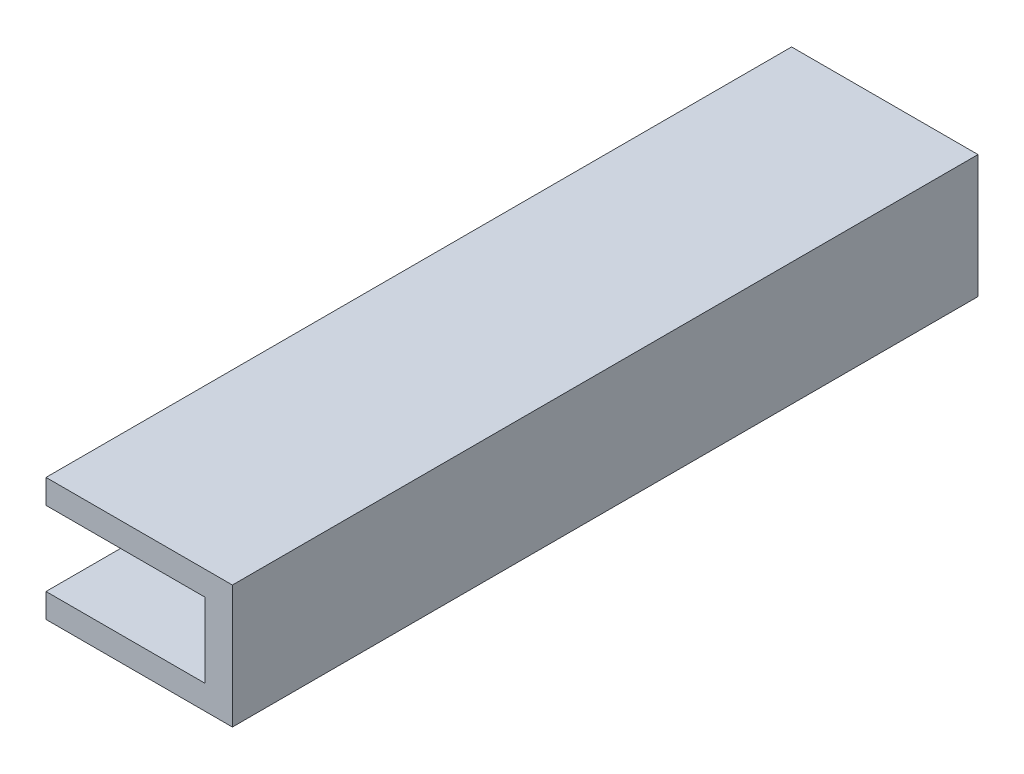
ISO-10303-21;
HEADER;
FILE_DESCRIPTION(('STEP AP214'),'2;1');
FILE_NAME('part.step','',(''),(''),'','','');
FILE_SCHEMA(('AUTOMOTIVE_DESIGN { 1 0 10303 214 1 1 1 1 }'));
ENDSEC;
DATA;
#1=APPLICATION_CONTEXT('core data for automotive mechanical design processes');
#2=APPLICATION_PROTOCOL_DEFINITION('international standard','automotive_design',2000,#1);
#3=PRODUCT_CONTEXT('',#1,'mechanical');
#4=PRODUCT('Part','Part','',(#3));
#5=PRODUCT_RELATED_PRODUCT_CATEGORY('part','',(#4));
#6=PRODUCT_DEFINITION_FORMATION('','',#4);
#7=PRODUCT_DEFINITION_CONTEXT('part definition',#1,'design');
#8=PRODUCT_DEFINITION('design','',#6,#7);
#9=PRODUCT_DEFINITION_SHAPE('','',#8);
#10=(LENGTH_UNIT() NAMED_UNIT(*) SI_UNIT(.MILLI.,.METRE.));
#11=(NAMED_UNIT(*) PLANE_ANGLE_UNIT() SI_UNIT($,.RADIAN.));
#12=(NAMED_UNIT(*) SI_UNIT($,.STERADIAN.) SOLID_ANGLE_UNIT());
#13=UNCERTAINTY_MEASURE_WITH_UNIT(LENGTH_MEASURE(1.E-05),#10,'distance_accuracy_value','');
#14=(GEOMETRIC_REPRESENTATION_CONTEXT(3) GLOBAL_UNCERTAINTY_ASSIGNED_CONTEXT((#13)) GLOBAL_UNIT_ASSIGNED_CONTEXT((#10,
#11,#12)) REPRESENTATION_CONTEXT('',''));
#15=CARTESIAN_POINT('',(0.,0.,0.));
#16=DIRECTION('',(0.,0.,1.));
#17=DIRECTION('',(1.,0.,0.));
#18=AXIS2_PLACEMENT_3D('',#15,#16,#17);
#19=CARTESIAN_POINT('',(-50.,33.,200.));
#20=DIRECTION('',(1.,0.,0.));
#21=DIRECTION('',(0.,0.,-1.));
#22=AXIS2_PLACEMENT_3D('',#19,#20,#21);
#23=PLANE('',#22);
#24=DIRECTION('',(0.,-1.,0.));
#25=VECTOR('',#24,1.);
#26=CARTESIAN_POINT('',(-50.,33.,0.));
#27=LINE('',#26,#25);
#28=CARTESIAN_POINT('',(-50.,33.,0.));
#29=VERTEX_POINT('',#28);
#30=CARTESIAN_POINT('',(-50.,26.5,0.));
#31=VERTEX_POINT('',#30);
#32=EDGE_CURVE('E133',#29,#31,#27,.T.);
#33=ORIENTED_EDGE('',*,*,#32,.T.);
#34=DIRECTION('',(0.,0.,-1.));
#35=VECTOR('',#34,1.);
#36=CARTESIAN_POINT('',(-50.,26.5,200.));
#37=LINE('',#36,#35);
#38=CARTESIAN_POINT('',(-50.,26.5,200.));
#39=VERTEX_POINT('',#38);
#40=EDGE_CURVE('E11',#39,#31,#37,.T.);
#41=ORIENTED_EDGE('',*,*,#40,.F.);
#42=DIRECTION('',(0.,-1.,0.));
#43=VECTOR('',#42,1.);
#44=CARTESIAN_POINT('',(-50.,33.,200.));
#45=LINE('',#44,#43);
#46=CARTESIAN_POINT('',(-50.,33.,200.));
#47=VERTEX_POINT('',#46);
#48=EDGE_CURVE('E147',#47,#39,#45,.T.);
#49=ORIENTED_EDGE('',*,*,#48,.F.);
#50=DIRECTION('',(0.,0.,-1.));
#51=VECTOR('',#50,1.);
#52=CARTESIAN_POINT('',(-50.,33.,200.));
#53=LINE('',#52,#51);
#54=EDGE_CURVE('E129',#47,#29,#53,.T.);
#55=ORIENTED_EDGE('',*,*,#54,.T.);
#56=EDGE_LOOP('',(#33,#41,#49,#55));
#57=FACE_BOUND('',#56,.T.);
#58=ADVANCED_FACE('F37',(#57),#23,.F.);
#59=CARTESIAN_POINT('',(-50.,26.5,200.));
#60=DIRECTION('',(0.,1.,0.));
#61=DIRECTION('',(-1.,0.,0.));
#62=AXIS2_PLACEMENT_3D('',#59,#60,#61);
#63=PLANE('',#62);
#64=DIRECTION('',(1.,0.,0.));
#65=VECTOR('',#64,1.);
#66=CARTESIAN_POINT('',(-50.,26.5,0.));
#67=LINE('',#66,#65);
#68=CARTESIAN_POINT('',(-7.32668805773785,26.5,0.));
#69=VERTEX_POINT('',#68);
#70=EDGE_CURVE('E136',#31,#69,#67,.T.);
#71=ORIENTED_EDGE('',*,*,#70,.T.);
#72=DIRECTION('',(0.,0.,-1.));
#73=VECTOR('',#72,1.);
#74=CARTESIAN_POINT('',(-7.32668805773785,26.5,200.));
#75=LINE('',#74,#73);
#76=CARTESIAN_POINT('',(-7.32668805773785,26.5,200.));
#77=VERTEX_POINT('',#76);
#78=EDGE_CURVE('E45',#77,#69,#75,.T.);
#79=ORIENTED_EDGE('',*,*,#78,.F.);
#80=DIRECTION('',(1.,0.,0.));
#81=VECTOR('',#80,1.);
#82=CARTESIAN_POINT('',(-50.,26.5,200.));
#83=LINE('',#82,#81);
#84=EDGE_CURVE('E96',#39,#77,#83,.T.);
#85=ORIENTED_EDGE('',*,*,#84,.F.);
#86=ORIENTED_EDGE('',*,*,#40,.T.);
#87=EDGE_LOOP('',(#71,#79,#85,#86));
#88=FACE_BOUND('',#87,.T.);
#89=ADVANCED_FACE('F182',(#88),#63,.F.);
#90=CARTESIAN_POINT('',(-7.32668805773785,26.5,200.));
#91=DIRECTION('',(1.,0.,0.));
#92=DIRECTION('',(0.,1.,0.));
#93=AXIS2_PLACEMENT_3D('',#90,#91,#92);
#94=PLANE('',#93);
#95=DIRECTION('',(0.,-1.,0.));
#96=VECTOR('',#95,1.);
#97=CARTESIAN_POINT('',(-7.32668805773785,26.5,0.));
#98=LINE('',#97,#96);
#99=CARTESIAN_POINT('',(-7.32668805773784,6.5,0.));
#100=VERTEX_POINT('',#99);
#101=EDGE_CURVE('E138',#69,#100,#98,.T.);
#102=ORIENTED_EDGE('',*,*,#101,.T.);
#103=DIRECTION('',(0.,0.,-1.));
#104=VECTOR('',#103,1.);
#105=CARTESIAN_POINT('',(-7.32668805773784,6.5,200.));
#106=LINE('',#105,#104);
#107=CARTESIAN_POINT('',(-7.32668805773784,6.5,200.));
#108=VERTEX_POINT('',#107);
#109=EDGE_CURVE('E154',#108,#100,#106,.T.);
#110=ORIENTED_EDGE('',*,*,#109,.F.);
#111=DIRECTION('',(0.,-1.,0.));
#112=VECTOR('',#111,1.);
#113=CARTESIAN_POINT('',(-7.32668805773785,26.5,200.));
#114=LINE('',#113,#112);
#115=EDGE_CURVE('E162',#77,#108,#114,.T.);
#116=ORIENTED_EDGE('',*,*,#115,.F.);
#117=ORIENTED_EDGE('',*,*,#78,.T.);
#118=EDGE_LOOP('',(#102,#110,#116,#117));
#119=FACE_BOUND('',#118,.T.);
#120=ADVANCED_FACE('F160',(#119),#94,.F.);
#121=CARTESIAN_POINT('',(-7.32668805773784,6.5,200.));
#122=DIRECTION('',(0.,-1.,0.));
#123=DIRECTION('',(1.,0.,0.));
#124=AXIS2_PLACEMENT_3D('',#121,#122,#123);
#125=PLANE('',#124);
#126=DIRECTION('',(-1.,0.,0.));
#127=VECTOR('',#126,1.);
#128=CARTESIAN_POINT('',(-7.32668805773784,6.5,0.));
#129=LINE('',#128,#127);
#130=CARTESIAN_POINT('',(-50.,6.5,0.));
#131=VERTEX_POINT('',#130);
#132=EDGE_CURVE('E140',#100,#131,#129,.T.);
#133=ORIENTED_EDGE('',*,*,#132,.T.);
#134=DIRECTION('',(0.,0.,-1.));
#135=VECTOR('',#134,1.);
#136=CARTESIAN_POINT('',(-50.,6.5,200.));
#137=LINE('',#136,#135);
#138=CARTESIAN_POINT('',(-50.,6.5,200.));
#139=VERTEX_POINT('',#138);
#140=EDGE_CURVE('E151',#139,#131,#137,.T.);
#141=ORIENTED_EDGE('',*,*,#140,.F.);
#142=DIRECTION('',(-1.,0.,0.));
#143=VECTOR('',#142,1.);
#144=CARTESIAN_POINT('',(-7.32668805773784,6.5,200.));
#145=LINE('',#144,#143);
#146=EDGE_CURVE('E174',#108,#139,#145,.T.);
#147=ORIENTED_EDGE('',*,*,#146,.F.);
#148=ORIENTED_EDGE('',*,*,#109,.T.);
#149=EDGE_LOOP('',(#133,#141,#147,#148));
#150=FACE_BOUND('',#149,.T.);
#151=ADVANCED_FACE('F170',(#150),#125,.F.);
#152=CARTESIAN_POINT('',(-50.,6.5,200.));
#153=DIRECTION('',(1.,0.,0.));
#154=DIRECTION('',(0.,0.,-1.));
#155=AXIS2_PLACEMENT_3D('',#152,#153,#154);
#156=PLANE('',#155);
#157=DIRECTION('',(0.,-1.,0.));
#158=VECTOR('',#157,1.);
#159=CARTESIAN_POINT('',(-50.,6.5,0.));
#160=LINE('',#159,#158);
#161=CARTESIAN_POINT('',(-50.,0.,0.));
#162=VERTEX_POINT('',#161);
#163=EDGE_CURVE('E142',#131,#162,#160,.T.);
#164=ORIENTED_EDGE('',*,*,#163,.T.);
#165=DIRECTION('',(0.,0.,-1.));
#166=VECTOR('',#165,1.);
#167=CARTESIAN_POINT('',(-50.,0.,200.));
#168=LINE('',#167,#166);
#169=CARTESIAN_POINT('',(-50.,0.,200.));
#170=VERTEX_POINT('',#169);
#171=EDGE_CURVE('E124',#170,#162,#168,.T.);
#172=ORIENTED_EDGE('',*,*,#171,.F.);
#173=DIRECTION('',(0.,-1.,0.));
#174=VECTOR('',#173,1.);
#175=CARTESIAN_POINT('',(-50.,6.5,200.));
#176=LINE('',#175,#174);
#177=EDGE_CURVE('E115',#139,#170,#176,.T.);
#178=ORIENTED_EDGE('',*,*,#177,.F.);
#179=ORIENTED_EDGE('',*,*,#140,.T.);
#180=EDGE_LOOP('',(#164,#172,#178,#179));
#181=FACE_BOUND('',#180,.T.);
#182=ADVANCED_FACE('F173',(#181),#156,.F.);
#183=CARTESIAN_POINT('',(-50.,0.,200.));
#184=DIRECTION('',(0.,1.,0.));
#185=DIRECTION('',(0.,0.,1.));
#186=AXIS2_PLACEMENT_3D('',#183,#184,#185);
#187=PLANE('',#186);
#188=DIRECTION('',(1.,0.,0.));
#189=VECTOR('',#188,1.);
#190=CARTESIAN_POINT('',(-50.,0.,0.));
#191=LINE('',#190,#189);
#192=CARTESIAN_POINT('',(0.,0.,0.));
#193=VERTEX_POINT('',#192);
#194=EDGE_CURVE('E123',#162,#193,#191,.T.);
#195=ORIENTED_EDGE('',*,*,#194,.T.);
#196=DIRECTION('',(0.,0.,-1.));
#197=VECTOR('',#196,1.);
#198=CARTESIAN_POINT('',(0.,0.,200.));
#199=LINE('',#198,#197);
#200=CARTESIAN_POINT('',(0.,0.,200.));
#201=VERTEX_POINT('',#200);
#202=EDGE_CURVE('E120',#201,#193,#199,.T.);
#203=ORIENTED_EDGE('',*,*,#202,.F.);
#204=DIRECTION('',(1.,0.,0.));
#205=VECTOR('',#204,1.);
#206=CARTESIAN_POINT('',(-50.,0.,200.));
#207=LINE('',#206,#205);
#208=EDGE_CURVE('E109',#170,#201,#207,.T.);
#209=ORIENTED_EDGE('',*,*,#208,.F.);
#210=ORIENTED_EDGE('',*,*,#171,.T.);
#211=EDGE_LOOP('',(#195,#203,#209,#210));
#212=FACE_BOUND('',#211,.T.);
#213=ADVANCED_FACE('F121',(#212),#187,.F.);
#214=CARTESIAN_POINT('',(0.,33.,200.));
#215=DIRECTION('',(-1.,0.,0.));
#216=DIRECTION('',(0.,0.,1.));
#217=AXIS2_PLACEMENT_3D('',#214,#215,#216);
#218=PLANE('',#217);
#219=DIRECTION('',(0.,1.,0.));
#220=VECTOR('',#219,1.);
#221=CARTESIAN_POINT('',(0.,33.,0.));
#222=LINE('',#221,#220);
#223=CARTESIAN_POINT('',(0.,33.,0.));
#224=VERTEX_POINT('',#223);
#225=EDGE_CURVE('E82',#193,#224,#222,.T.);
#226=ORIENTED_EDGE('',*,*,#225,.T.);
#227=DIRECTION('',(0.,0.,-1.));
#228=VECTOR('',#227,1.);
#229=CARTESIAN_POINT('',(0.,33.,200.));
#230=LINE('',#229,#228);
#231=CARTESIAN_POINT('',(0.,33.,200.));
#232=VERTEX_POINT('',#231);
#233=EDGE_CURVE('E125',#232,#224,#230,.T.);
#234=ORIENTED_EDGE('',*,*,#233,.F.);
#235=DIRECTION('',(0.,1.,0.));
#236=VECTOR('',#235,1.);
#237=CARTESIAN_POINT('',(0.,33.,200.));
#238=LINE('',#237,#236);
#239=EDGE_CURVE('E113',#201,#232,#238,.T.);
#240=ORIENTED_EDGE('',*,*,#239,.F.);
#241=ORIENTED_EDGE('',*,*,#202,.T.);
#242=EDGE_LOOP('',(#226,#234,#240,#241));
#243=FACE_BOUND('',#242,.T.);
#244=ADVANCED_FACE('F127',(#243),#218,.F.);
#245=CARTESIAN_POINT('',(-50.,33.,200.));
#246=DIRECTION('',(0.,-1.,0.));
#247=DIRECTION('',(0.,0.,-1.));
#248=AXIS2_PLACEMENT_3D('',#245,#246,#247);
#249=PLANE('',#248);
#250=DIRECTION('',(-1.,0.,0.));
#251=VECTOR('',#250,1.);
#252=CARTESIAN_POINT('',(-50.,33.,0.));
#253=LINE('',#252,#251);
#254=EDGE_CURVE('E88',#224,#29,#253,.T.);
#255=ORIENTED_EDGE('',*,*,#254,.T.);
#256=ORIENTED_EDGE('',*,*,#54,.F.);
#257=DIRECTION('',(-1.,0.,0.));
#258=VECTOR('',#257,1.);
#259=CARTESIAN_POINT('',(-50.,33.,200.));
#260=LINE('',#259,#258);
#261=EDGE_CURVE('E53',#232,#47,#260,.T.);
#262=ORIENTED_EDGE('',*,*,#261,.F.);
#263=ORIENTED_EDGE('',*,*,#233,.T.);
#264=EDGE_LOOP('',(#255,#256,#262,#263));
#265=FACE_BOUND('',#264,.T.);
#266=ADVANCED_FACE('F198',(#265),#249,.F.);
#267=CARTESIAN_POINT('',(0.,0.,200.));
#268=DIRECTION('',(0.,0.,1.));
#269=DIRECTION('',(1.,0.,0.));
#270=AXIS2_PLACEMENT_3D('',#267,#268,#269);
#271=PLANE('',#270);
#272=ORIENTED_EDGE('',*,*,#48,.T.);
#273=ORIENTED_EDGE('',*,*,#84,.T.);
#274=ORIENTED_EDGE('',*,*,#115,.T.);
#275=ORIENTED_EDGE('',*,*,#146,.T.);
#276=ORIENTED_EDGE('',*,*,#177,.T.);
#277=ORIENTED_EDGE('',*,*,#208,.T.);
#278=ORIENTED_EDGE('',*,*,#239,.T.);
#279=ORIENTED_EDGE('',*,*,#261,.T.);
#280=EDGE_LOOP('',(#272,#273,#274,#275,#276,#277,#278,#279));
#281=FACE_BOUND('',#280,.T.);
#282=ADVANCED_FACE('F111',(#281),#271,.T.);
#283=CARTESIAN_POINT('',(0.,0.,0.));
#284=DIRECTION('',(0.,0.,1.));
#285=DIRECTION('',(1.,0.,0.));
#286=AXIS2_PLACEMENT_3D('',#283,#284,#285);
#287=PLANE('',#286);
#288=ORIENTED_EDGE('',*,*,#32,.F.);
#289=ORIENTED_EDGE('',*,*,#254,.F.);
#290=ORIENTED_EDGE('',*,*,#225,.F.);
#291=ORIENTED_EDGE('',*,*,#194,.F.);
#292=ORIENTED_EDGE('',*,*,#163,.F.);
#293=ORIENTED_EDGE('',*,*,#132,.F.);
#294=ORIENTED_EDGE('',*,*,#101,.F.);
#295=ORIENTED_EDGE('',*,*,#70,.F.);
#296=EDGE_LOOP('',(#288,#289,#290,#291,#292,#293,#294,#295));
#297=FACE_BOUND('',#296,.T.);
#298=ADVANCED_FACE('F166',(#297),#287,.F.);
#299=CLOSED_SHELL('',(#58,#89,#120,#151,#182,#213,#244,#266,#282,#298));
#300=MANIFOLD_SOLID_BREP('B2',#299);
#301=ADVANCED_BREP_SHAPE_REPRESENTATION('',(#18,#300),#14);
#302=SHAPE_DEFINITION_REPRESENTATION(#9,#301);
ENDSEC;
END-ISO-10303-21;
